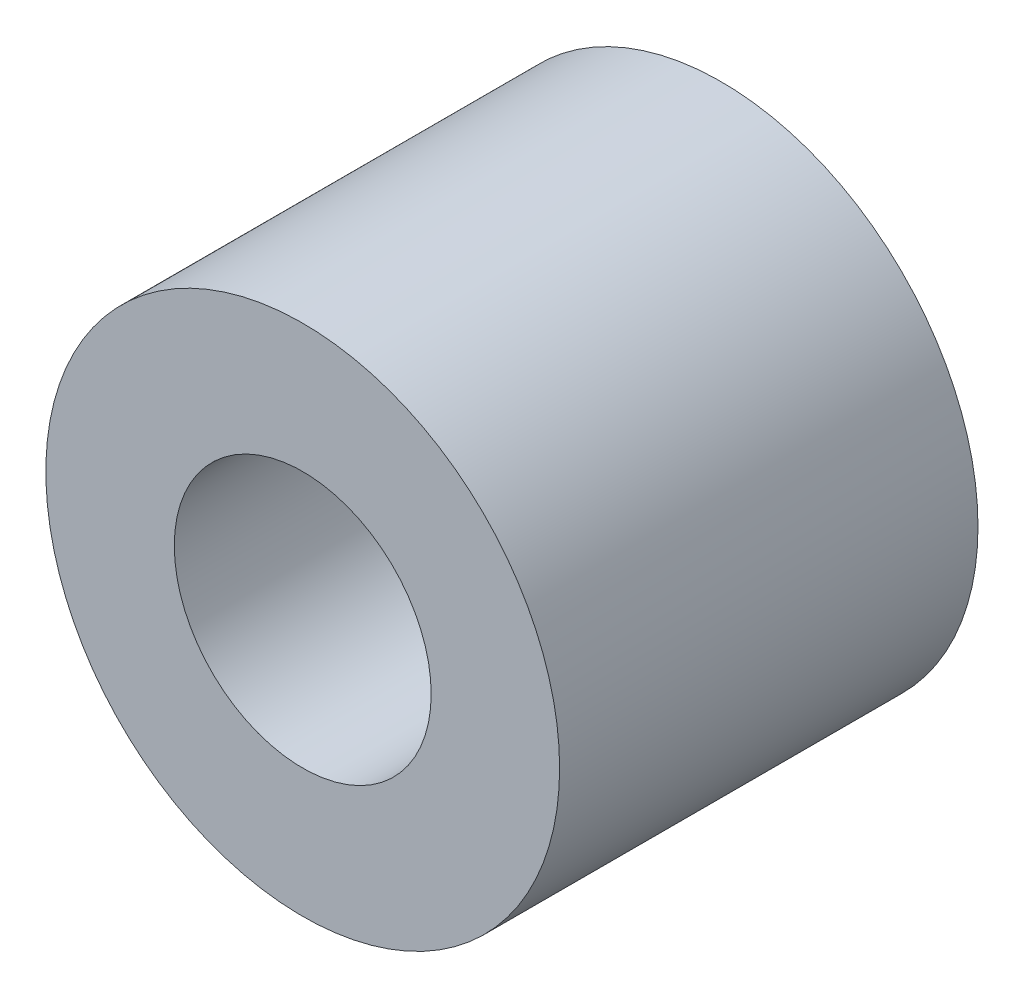
ISO-10303-21;
HEADER;
FILE_DESCRIPTION(('STEP AP214'),'2;1');
FILE_NAME('part.step','',(''),(''),'','','');
FILE_SCHEMA(('AUTOMOTIVE_DESIGN { 1 0 10303 214 1 1 1 1 }'));
ENDSEC;
DATA;
#1=APPLICATION_CONTEXT('core data for automotive mechanical design processes');
#2=APPLICATION_PROTOCOL_DEFINITION('international standard','automotive_design',2000,#1);
#3=PRODUCT_CONTEXT('',#1,'mechanical');
#4=PRODUCT('Part','Part','',(#3));
#5=PRODUCT_RELATED_PRODUCT_CATEGORY('part','',(#4));
#6=PRODUCT_DEFINITION_FORMATION('','',#4);
#7=PRODUCT_DEFINITION_CONTEXT('part definition',#1,'design');
#8=PRODUCT_DEFINITION('design','',#6,#7);
#9=PRODUCT_DEFINITION_SHAPE('','',#8);
#10=(LENGTH_UNIT() NAMED_UNIT(*) SI_UNIT(.MILLI.,.METRE.));
#11=(NAMED_UNIT(*) PLANE_ANGLE_UNIT() SI_UNIT($,.RADIAN.));
#12=(NAMED_UNIT(*) SI_UNIT($,.STERADIAN.) SOLID_ANGLE_UNIT());
#13=UNCERTAINTY_MEASURE_WITH_UNIT(LENGTH_MEASURE(1.E-05),#10,'distance_accuracy_value','');
#14=(GEOMETRIC_REPRESENTATION_CONTEXT(3) GLOBAL_UNCERTAINTY_ASSIGNED_CONTEXT((#13)) GLOBAL_UNIT_ASSIGNED_CONTEXT((#10,
#11,#12)) REPRESENTATION_CONTEXT('',''));
#15=CARTESIAN_POINT('',(0.,0.,0.));
#16=DIRECTION('',(0.,0.,1.));
#17=DIRECTION('',(1.,0.,0.));
#18=AXIS2_PLACEMENT_3D('',#15,#16,#17);
#19=CARTESIAN_POINT('',(0.,0.,5.7));
#20=DIRECTION('',(0.,0.,1.));
#21=DIRECTION('',(1.,0.,0.));
#22=AXIS2_PLACEMENT_3D('',#19,#20,#21);
#23=PLANE('',#22);
#24=CARTESIAN_POINT('',(0.,0.,5.7));
#25=DIRECTION('',(0.,0.,1.));
#26=DIRECTION('',(1.,0.,0.));
#27=AXIS2_PLACEMENT_3D('',#24,#25,#26);
#28=CIRCLE('',#27,3.5);
#29=CARTESIAN_POINT('',(3.5,0.,5.7));
#30=VERTEX_POINT('',#29);
#31=EDGE_CURVE('E10',#30,#30,#28,.T.);
#32=ORIENTED_EDGE('',*,*,#31,.T.);
#33=EDGE_LOOP('',(#32));
#34=FACE_BOUND('',#33,.T.);
#35=CARTESIAN_POINT('',(0.,0.,5.7));
#36=DIRECTION('',(0.,0.,1.));
#37=DIRECTION('',(1.,0.,0.));
#38=AXIS2_PLACEMENT_3D('',#35,#36,#37);
#39=CIRCLE('',#38,1.75);
#40=CARTESIAN_POINT('',(1.75,0.,5.7));
#41=VERTEX_POINT('',#40);
#42=EDGE_CURVE('E46',#41,#41,#39,.T.);
#43=ORIENTED_EDGE('',*,*,#42,.F.);
#44=EDGE_LOOP('',(#43));
#45=FACE_BOUND('',#44,.T.);
#46=ADVANCED_FACE('F35',(#34,#45),#23,.T.);
#47=CARTESIAN_POINT('',(0.,0.,0.));
#48=DIRECTION('',(0.,0.,1.));
#49=DIRECTION('',(1.,0.,0.));
#50=AXIS2_PLACEMENT_3D('',#47,#48,#49);
#51=PLANE('',#50);
#52=CARTESIAN_POINT('',(0.,0.,0.));
#53=DIRECTION('',(0.,0.,1.));
#54=DIRECTION('',(1.,0.,0.));
#55=AXIS2_PLACEMENT_3D('',#52,#53,#54);
#56=CIRCLE('',#55,3.5);
#57=CARTESIAN_POINT('',(3.5,0.,0.));
#58=VERTEX_POINT('',#57);
#59=EDGE_CURVE('E39',#58,#58,#56,.T.);
#60=ORIENTED_EDGE('',*,*,#59,.F.);
#61=EDGE_LOOP('',(#60));
#62=FACE_BOUND('',#61,.T.);
#63=CARTESIAN_POINT('',(0.,0.,0.));
#64=DIRECTION('',(0.,0.,1.));
#65=DIRECTION('',(1.,0.,0.));
#66=AXIS2_PLACEMENT_3D('',#63,#64,#65);
#67=CIRCLE('',#66,1.75);
#68=CARTESIAN_POINT('',(1.75,0.,0.));
#69=VERTEX_POINT('',#68);
#70=EDGE_CURVE('E48',#69,#69,#67,.T.);
#71=ORIENTED_EDGE('',*,*,#70,.T.);
#72=EDGE_LOOP('',(#71));
#73=FACE_BOUND('',#72,.T.);
#74=ADVANCED_FACE('F58',(#62,#73),#51,.F.);
#75=CARTESIAN_POINT('',(0.,0.,5.7));
#76=DIRECTION('',(0.,0.,-1.));
#77=DIRECTION('',(-1.,0.,0.));
#78=AXIS2_PLACEMENT_3D('',#75,#76,#77);
#79=CYLINDRICAL_SURFACE('',#78,3.5);
#80=ORIENTED_EDGE('',*,*,#31,.F.);
#81=EDGE_LOOP('',(#80));
#82=FACE_BOUND('',#81,.T.);
#83=ORIENTED_EDGE('',*,*,#59,.T.);
#84=EDGE_LOOP('',(#83));
#85=FACE_BOUND('',#84,.T.);
#86=ADVANCED_FACE('F37',(#82,#85),#79,.T.);
#87=CARTESIAN_POINT('',(0.,0.,5.7));
#88=DIRECTION('',(0.,0.,-1.));
#89=DIRECTION('',(-1.,0.,0.));
#90=AXIS2_PLACEMENT_3D('',#87,#88,#89);
#91=CYLINDRICAL_SURFACE('',#90,1.75);
#92=ORIENTED_EDGE('',*,*,#42,.T.);
#93=EDGE_LOOP('',(#92));
#94=FACE_BOUND('',#93,.T.);
#95=ORIENTED_EDGE('',*,*,#70,.F.);
#96=EDGE_LOOP('',(#95));
#97=FACE_BOUND('',#96,.T.);
#98=ADVANCED_FACE('F54',(#94,#97),#91,.F.);
#99=CLOSED_SHELL('',(#46,#74,#86,#98));
#100=MANIFOLD_SOLID_BREP('B2',#99);
#101=ADVANCED_BREP_SHAPE_REPRESENTATION('',(#18,#100),#14);
#102=SHAPE_DEFINITION_REPRESENTATION(#9,#101);
ENDSEC;
END-ISO-10303-21;
